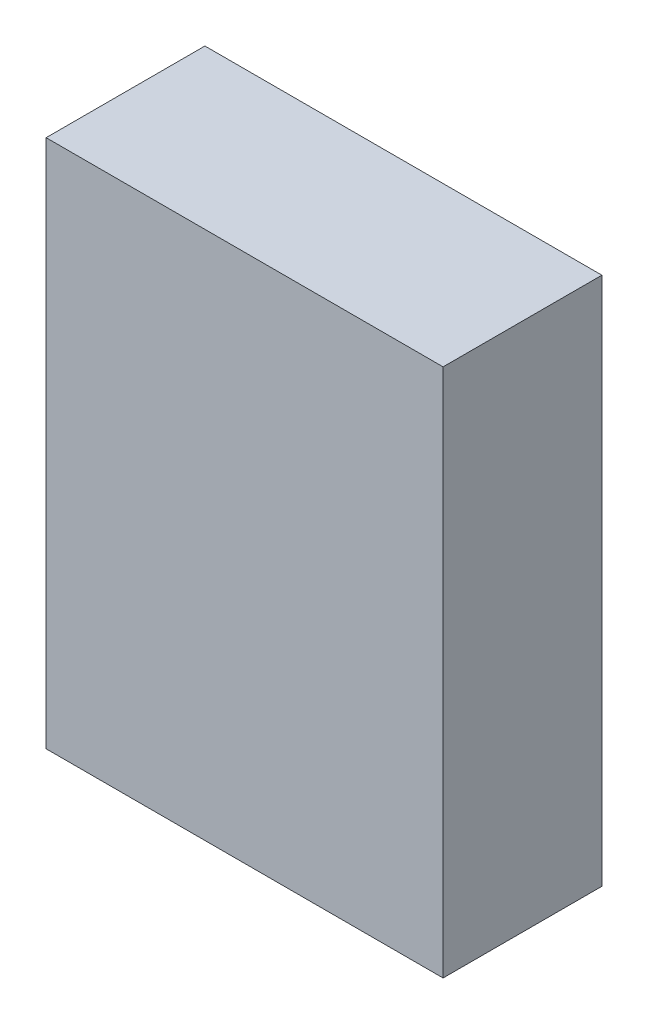
ISO-10303-21;
HEADER;
FILE_DESCRIPTION(('STEP AP214'),'2;1');
FILE_NAME('part.step','',(''),(''),'','','');
FILE_SCHEMA(('AUTOMOTIVE_DESIGN { 1 0 10303 214 1 1 1 1 }'));
ENDSEC;
DATA;
#1=APPLICATION_CONTEXT('core data for automotive mechanical design processes');
#2=APPLICATION_PROTOCOL_DEFINITION('international standard','automotive_design',2000,#1);
#3=PRODUCT_CONTEXT('',#1,'mechanical');
#4=PRODUCT('Part','Part','',(#3));
#5=PRODUCT_RELATED_PRODUCT_CATEGORY('part','',(#4));
#6=PRODUCT_DEFINITION_FORMATION('','',#4);
#7=PRODUCT_DEFINITION_CONTEXT('part definition',#1,'design');
#8=PRODUCT_DEFINITION('design','',#6,#7);
#9=PRODUCT_DEFINITION_SHAPE('','',#8);
#10=(LENGTH_UNIT() NAMED_UNIT(*) SI_UNIT(.MILLI.,.METRE.));
#11=(NAMED_UNIT(*) PLANE_ANGLE_UNIT() SI_UNIT($,.RADIAN.));
#12=(NAMED_UNIT(*) SI_UNIT($,.STERADIAN.) SOLID_ANGLE_UNIT());
#13=UNCERTAINTY_MEASURE_WITH_UNIT(LENGTH_MEASURE(1.E-05),#10,'distance_accuracy_value','');
#14=(GEOMETRIC_REPRESENTATION_CONTEXT(3) GLOBAL_UNCERTAINTY_ASSIGNED_CONTEXT((#13)) GLOBAL_UNIT_ASSIGNED_CONTEXT((#10,
#11,#12)) REPRESENTATION_CONTEXT('',''));
#15=CARTESIAN_POINT('',(0.,0.,0.));
#16=DIRECTION('',(0.,0.,1.));
#17=DIRECTION('',(1.,0.,0.));
#18=AXIS2_PLACEMENT_3D('',#15,#16,#17);
#19=CARTESIAN_POINT('',(37.5,50.,30.));
#20=DIRECTION('',(-1.,0.,0.));
#21=DIRECTION('',(0.,-1.,0.));
#22=AXIS2_PLACEMENT_3D('',#19,#20,#21);
#23=PLANE('',#22);
#24=DIRECTION('',(0.,1.,0.));
#25=VECTOR('',#24,1.);
#26=CARTESIAN_POINT('',(37.5,50.,0.));
#27=LINE('',#26,#25);
#28=CARTESIAN_POINT('',(37.5,-50.,0.));
#29=VERTEX_POINT('',#28);
#30=CARTESIAN_POINT('',(37.5,50.,0.));
#31=VERTEX_POINT('',#30);
#32=EDGE_CURVE('E113',#29,#31,#27,.T.);
#33=ORIENTED_EDGE('',*,*,#32,.T.);
#34=DIRECTION('',(0.,0.,-1.));
#35=VECTOR('',#34,1.);
#36=CARTESIAN_POINT('',(37.5,50.,30.));
#37=LINE('',#36,#35);
#38=CARTESIAN_POINT('',(37.5,50.,30.));
#39=VERTEX_POINT('',#38);
#40=EDGE_CURVE('E11',#39,#31,#37,.T.);
#41=ORIENTED_EDGE('',*,*,#40,.F.);
#42=DIRECTION('',(0.,1.,0.));
#43=VECTOR('',#42,1.);
#44=CARTESIAN_POINT('',(37.5,50.,30.));
#45=LINE('',#44,#43);
#46=CARTESIAN_POINT('',(37.5,-50.,30.));
#47=VERTEX_POINT('',#46);
#48=EDGE_CURVE('E97',#47,#39,#45,.T.);
#49=ORIENTED_EDGE('',*,*,#48,.F.);
#50=DIRECTION('',(0.,0.,-1.));
#51=VECTOR('',#50,1.);
#52=CARTESIAN_POINT('',(37.5,-50.,30.));
#53=LINE('',#52,#51);
#54=EDGE_CURVE('E109',#47,#29,#53,.T.);
#55=ORIENTED_EDGE('',*,*,#54,.T.);
#56=EDGE_LOOP('',(#33,#41,#49,#55));
#57=FACE_BOUND('',#56,.T.);
#58=ADVANCED_FACE('F45',(#57),#23,.F.);
#59=CARTESIAN_POINT('',(-37.5,50.,30.));
#60=DIRECTION('',(0.,-1.,0.));
#61=DIRECTION('',(0.,0.,-1.));
#62=AXIS2_PLACEMENT_3D('',#59,#60,#61);
#63=PLANE('',#62);
#64=DIRECTION('',(-1.,0.,0.));
#65=VECTOR('',#64,1.);
#66=CARTESIAN_POINT('',(-37.5,50.,0.));
#67=LINE('',#66,#65);
#68=CARTESIAN_POINT('',(-37.5,50.,0.));
#69=VERTEX_POINT('',#68);
#70=EDGE_CURVE('E102',#31,#69,#67,.T.);
#71=ORIENTED_EDGE('',*,*,#70,.T.);
#72=DIRECTION('',(0.,0.,-1.));
#73=VECTOR('',#72,1.);
#74=CARTESIAN_POINT('',(-37.5,50.,30.));
#75=LINE('',#74,#73);
#76=CARTESIAN_POINT('',(-37.5,50.,30.));
#77=VERTEX_POINT('',#76);
#78=EDGE_CURVE('E54',#77,#69,#75,.T.);
#79=ORIENTED_EDGE('',*,*,#78,.F.);
#80=DIRECTION('',(-1.,0.,0.));
#81=VECTOR('',#80,1.);
#82=CARTESIAN_POINT('',(-37.5,50.,30.));
#83=LINE('',#82,#81);
#84=EDGE_CURVE('E92',#39,#77,#83,.T.);
#85=ORIENTED_EDGE('',*,*,#84,.F.);
#86=ORIENTED_EDGE('',*,*,#40,.T.);
#87=EDGE_LOOP('',(#71,#79,#85,#86));
#88=FACE_BOUND('',#87,.T.);
#89=ADVANCED_FACE('F101',(#88),#63,.F.);
#90=CARTESIAN_POINT('',(-37.5,50.,30.));
#91=DIRECTION('',(1.,0.,0.));
#92=DIRECTION('',(0.,1.,0.));
#93=AXIS2_PLACEMENT_3D('',#90,#91,#92);
#94=PLANE('',#93);
#95=DIRECTION('',(0.,-1.,0.));
#96=VECTOR('',#95,1.);
#97=CARTESIAN_POINT('',(-37.5,50.,0.));
#98=LINE('',#97,#96);
#99=CARTESIAN_POINT('',(-37.5,-50.,0.));
#100=VERTEX_POINT('',#99);
#101=EDGE_CURVE('E79',#69,#100,#98,.T.);
#102=ORIENTED_EDGE('',*,*,#101,.T.);
#103=DIRECTION('',(0.,0.,-1.));
#104=VECTOR('',#103,1.);
#105=CARTESIAN_POINT('',(-37.5,-50.,30.));
#106=LINE('',#105,#104);
#107=CARTESIAN_POINT('',(-37.5,-50.,30.));
#108=VERTEX_POINT('',#107);
#109=EDGE_CURVE('E104',#108,#100,#106,.T.);
#110=ORIENTED_EDGE('',*,*,#109,.F.);
#111=DIRECTION('',(0.,-1.,0.));
#112=VECTOR('',#111,1.);
#113=CARTESIAN_POINT('',(-37.5,50.,30.));
#114=LINE('',#113,#112);
#115=EDGE_CURVE('E95',#77,#108,#114,.T.);
#116=ORIENTED_EDGE('',*,*,#115,.F.);
#117=ORIENTED_EDGE('',*,*,#78,.T.);
#118=EDGE_LOOP('',(#102,#110,#116,#117));
#119=FACE_BOUND('',#118,.T.);
#120=ADVANCED_FACE('F105',(#119),#94,.F.);
#121=CARTESIAN_POINT('',(-37.5,-50.,30.));
#122=DIRECTION('',(0.,1.,0.));
#123=DIRECTION('',(0.,0.,1.));
#124=AXIS2_PLACEMENT_3D('',#121,#122,#123);
#125=PLANE('',#124);
#126=DIRECTION('',(1.,0.,0.));
#127=VECTOR('',#126,1.);
#128=CARTESIAN_POINT('',(-37.5,-50.,0.));
#129=LINE('',#128,#127);
#130=EDGE_CURVE('E85',#100,#29,#129,.T.);
#131=ORIENTED_EDGE('',*,*,#130,.T.);
#132=ORIENTED_EDGE('',*,*,#54,.F.);
#133=DIRECTION('',(1.,0.,0.));
#134=VECTOR('',#133,1.);
#135=CARTESIAN_POINT('',(-37.5,-50.,30.));
#136=LINE('',#135,#134);
#137=EDGE_CURVE('E62',#108,#47,#136,.T.);
#138=ORIENTED_EDGE('',*,*,#137,.F.);
#139=ORIENTED_EDGE('',*,*,#109,.T.);
#140=EDGE_LOOP('',(#131,#132,#138,#139));
#141=FACE_BOUND('',#140,.T.);
#142=ADVANCED_FACE('F126',(#141),#125,.F.);
#143=CARTESIAN_POINT('',(0.,0.,30.));
#144=DIRECTION('',(0.,0.,1.));
#145=DIRECTION('',(1.,0.,0.));
#146=AXIS2_PLACEMENT_3D('',#143,#144,#145);
#147=PLANE('',#146);
#148=ORIENTED_EDGE('',*,*,#48,.T.);
#149=ORIENTED_EDGE('',*,*,#84,.T.);
#150=ORIENTED_EDGE('',*,*,#115,.T.);
#151=ORIENTED_EDGE('',*,*,#137,.T.);
#152=EDGE_LOOP('',(#148,#149,#150,#151));
#153=FACE_BOUND('',#152,.T.);
#154=ADVANCED_FACE('F93',(#153),#147,.T.);
#155=CARTESIAN_POINT('',(0.,0.,0.));
#156=DIRECTION('',(0.,0.,1.));
#157=DIRECTION('',(1.,0.,0.));
#158=AXIS2_PLACEMENT_3D('',#155,#156,#157);
#159=PLANE('',#158);
#160=ORIENTED_EDGE('',*,*,#32,.F.);
#161=ORIENTED_EDGE('',*,*,#130,.F.);
#162=ORIENTED_EDGE('',*,*,#101,.F.);
#163=ORIENTED_EDGE('',*,*,#70,.F.);
#164=EDGE_LOOP('',(#160,#161,#162,#163));
#165=FACE_BOUND('',#164,.T.);
#166=ADVANCED_FACE('F129',(#165),#159,.F.);
#167=CLOSED_SHELL('',(#58,#89,#120,#142,#154,#166));
#168=MANIFOLD_SOLID_BREP('B2',#167);
#169=ADVANCED_BREP_SHAPE_REPRESENTATION('',(#18,#168),#14);
#170=SHAPE_DEFINITION_REPRESENTATION(#9,#169);
ENDSEC;
END-ISO-10303-21;
